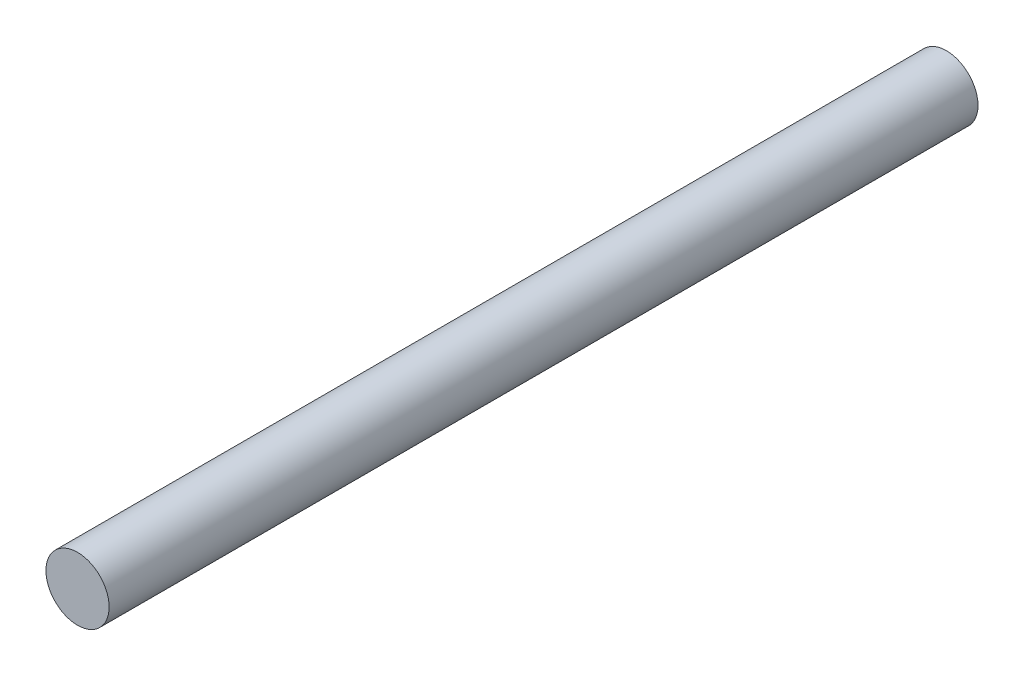
ISO-10303-21;
HEADER;
FILE_DESCRIPTION(('STEP AP214'),'2;1');
FILE_NAME('part.step','',(''),(''),'','','');
FILE_SCHEMA(('AUTOMOTIVE_DESIGN { 1 0 10303 214 1 1 1 1 }'));
ENDSEC;
DATA;
#1=APPLICATION_CONTEXT('core data for automotive mechanical design processes');
#2=APPLICATION_PROTOCOL_DEFINITION('international standard','automotive_design',2000,#1);
#3=PRODUCT_CONTEXT('',#1,'mechanical');
#4=PRODUCT('Part','Part','',(#3));
#5=PRODUCT_RELATED_PRODUCT_CATEGORY('part','',(#4));
#6=PRODUCT_DEFINITION_FORMATION('','',#4);
#7=PRODUCT_DEFINITION_CONTEXT('part definition',#1,'design');
#8=PRODUCT_DEFINITION('design','',#6,#7);
#9=PRODUCT_DEFINITION_SHAPE('','',#8);
#10=(LENGTH_UNIT() NAMED_UNIT(*) SI_UNIT(.MILLI.,.METRE.));
#11=(NAMED_UNIT(*) PLANE_ANGLE_UNIT() SI_UNIT($,.RADIAN.));
#12=(NAMED_UNIT(*) SI_UNIT($,.STERADIAN.) SOLID_ANGLE_UNIT());
#13=UNCERTAINTY_MEASURE_WITH_UNIT(LENGTH_MEASURE(1.E-05),#10,'distance_accuracy_value','');
#14=(GEOMETRIC_REPRESENTATION_CONTEXT(3) GLOBAL_UNCERTAINTY_ASSIGNED_CONTEXT((#13)) GLOBAL_UNIT_ASSIGNED_CONTEXT((#10,
#11,#12)) REPRESENTATION_CONTEXT('',''));
#15=CARTESIAN_POINT('',(0.,0.,0.));
#16=DIRECTION('',(0.,0.,1.));
#17=DIRECTION('',(1.,0.,0.));
#18=AXIS2_PLACEMENT_3D('',#15,#16,#17);
#19=CARTESIAN_POINT('',(0.,0.,-41.25));
#20=DIRECTION('',(0.,0.,1.));
#21=DIRECTION('',(1.,0.,0.));
#22=AXIS2_PLACEMENT_3D('',#19,#20,#21);
#23=CYLINDRICAL_SURFACE('',#22,3.);
#24=CARTESIAN_POINT('',(0.,0.,-41.25));
#25=DIRECTION('',(0.,0.,1.));
#26=DIRECTION('',(1.,0.,0.));
#27=AXIS2_PLACEMENT_3D('',#24,#25,#26);
#28=CIRCLE('',#27,3.);
#29=CARTESIAN_POINT('',(3.,0.,-41.25));
#30=VERTEX_POINT('',#29);
#31=EDGE_CURVE('E10',#30,#30,#28,.T.);
#32=ORIENTED_EDGE('',*,*,#31,.T.);
#33=EDGE_LOOP('',(#32));
#34=FACE_BOUND('',#33,.T.);
#35=CARTESIAN_POINT('',(0.,0.,41.25));
#36=DIRECTION('',(0.,0.,1.));
#37=DIRECTION('',(1.,0.,0.));
#38=AXIS2_PLACEMENT_3D('',#35,#36,#37);
#39=CIRCLE('',#38,3.);
#40=CARTESIAN_POINT('',(3.,0.,41.25));
#41=VERTEX_POINT('',#40);
#42=EDGE_CURVE('E39',#41,#41,#39,.T.);
#43=ORIENTED_EDGE('',*,*,#42,.F.);
#44=EDGE_LOOP('',(#43));
#45=FACE_BOUND('',#44,.T.);
#46=ADVANCED_FACE('F33',(#34,#45),#23,.T.);
#47=CARTESIAN_POINT('',(0.,0.,-41.25));
#48=DIRECTION('',(0.,0.,1.));
#49=DIRECTION('',(1.,0.,0.));
#50=AXIS2_PLACEMENT_3D('',#47,#48,#49);
#51=PLANE('',#50);
#52=ORIENTED_EDGE('',*,*,#31,.F.);
#53=EDGE_LOOP('',(#52));
#54=FACE_BOUND('',#53,.T.);
#55=ADVANCED_FACE('F48',(#54),#51,.F.);
#56=CARTESIAN_POINT('',(0.,0.,41.25));
#57=DIRECTION('',(0.,0.,1.));
#58=DIRECTION('',(1.,0.,0.));
#59=AXIS2_PLACEMENT_3D('',#56,#57,#58);
#60=PLANE('',#59);
#61=ORIENTED_EDGE('',*,*,#42,.T.);
#62=EDGE_LOOP('',(#61));
#63=FACE_BOUND('',#62,.T.);
#64=ADVANCED_FACE('F45',(#63),#60,.T.);
#65=CLOSED_SHELL('',(#46,#55,#64));
#66=MANIFOLD_SOLID_BREP('B2',#65);
#67=ADVANCED_BREP_SHAPE_REPRESENTATION('',(#18,#66),#14);
#68=SHAPE_DEFINITION_REPRESENTATION(#9,#67);
ENDSEC;
END-ISO-10303-21;
